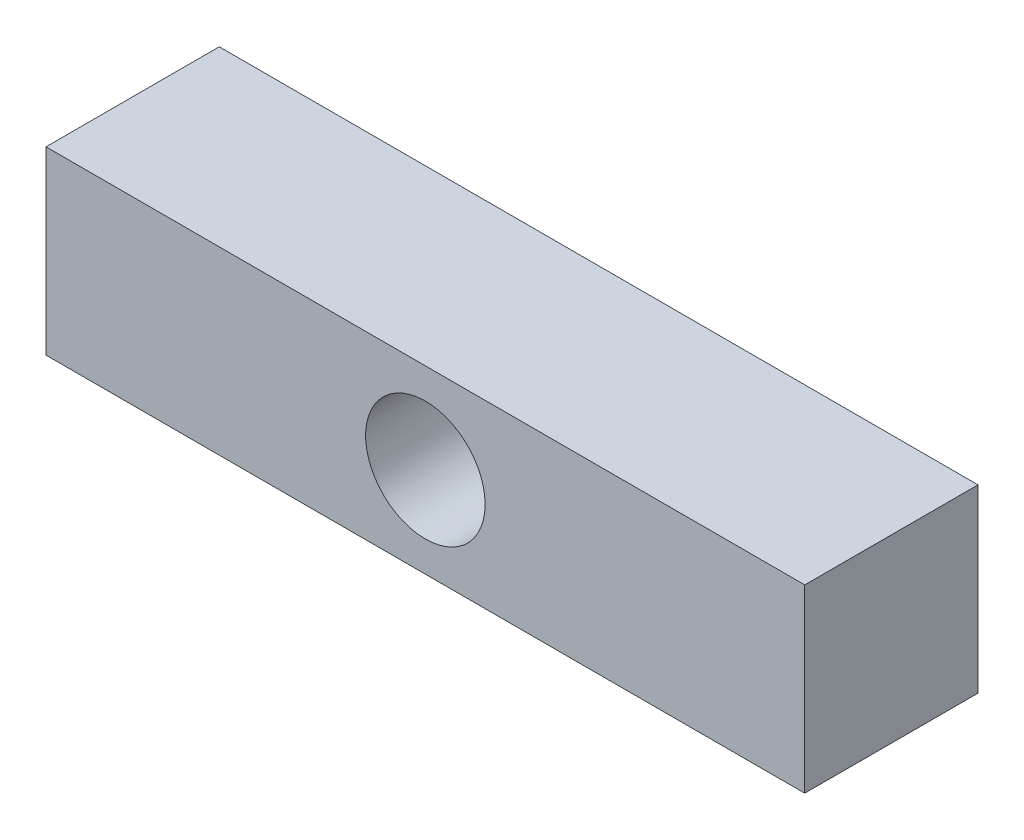
ISO-10303-21;
HEADER;
FILE_DESCRIPTION(('STEP AP214'),'2;1');
FILE_NAME('part.step','',(''),(''),'','','');
FILE_SCHEMA(('AUTOMOTIVE_DESIGN { 1 0 10303 214 1 1 1 1 }'));
ENDSEC;
DATA;
#1=APPLICATION_CONTEXT('core data for automotive mechanical design processes');
#2=APPLICATION_PROTOCOL_DEFINITION('international standard','automotive_design',2000,#1);
#3=PRODUCT_CONTEXT('',#1,'mechanical');
#4=PRODUCT('Part','Part','',(#3));
#5=PRODUCT_RELATED_PRODUCT_CATEGORY('part','',(#4));
#6=PRODUCT_DEFINITION_FORMATION('','',#4);
#7=PRODUCT_DEFINITION_CONTEXT('part definition',#1,'design');
#8=PRODUCT_DEFINITION('design','',#6,#7);
#9=PRODUCT_DEFINITION_SHAPE('','',#8);
#10=(LENGTH_UNIT() NAMED_UNIT(*) SI_UNIT(.MILLI.,.METRE.));
#11=(NAMED_UNIT(*) PLANE_ANGLE_UNIT() SI_UNIT($,.RADIAN.));
#12=(NAMED_UNIT(*) SI_UNIT($,.STERADIAN.) SOLID_ANGLE_UNIT());
#13=UNCERTAINTY_MEASURE_WITH_UNIT(LENGTH_MEASURE(1.E-05),#10,'distance_accuracy_value','');
#14=(GEOMETRIC_REPRESENTATION_CONTEXT(3) GLOBAL_UNCERTAINTY_ASSIGNED_CONTEXT((#13)) GLOBAL_UNIT_ASSIGNED_CONTEXT((#10,
#11,#12)) REPRESENTATION_CONTEXT('',''));
#15=CARTESIAN_POINT('',(0.,0.,0.));
#16=DIRECTION('',(0.,0.,1.));
#17=DIRECTION('',(1.,0.,0.));
#18=AXIS2_PLACEMENT_3D('',#15,#16,#17);
#19=CARTESIAN_POINT('',(12.7,6.04,2.9));
#20=DIRECTION('',(-1.,0.,0.));
#21=DIRECTION('',(0.,0.,1.));
#22=AXIS2_PLACEMENT_3D('',#19,#20,#21);
#23=PLANE('',#22);
#24=DIRECTION('',(0.,0.,-1.));
#25=VECTOR('',#24,1.);
#26=CARTESIAN_POINT('',(12.7,0.,2.9));
#27=LINE('',#26,#25);
#28=CARTESIAN_POINT('',(12.7,0.,2.9));
#29=VERTEX_POINT('',#28);
#30=CARTESIAN_POINT('',(12.7,0.,-2.9));
#31=VERTEX_POINT('',#30);
#32=EDGE_CURVE('E113',#29,#31,#27,.T.);
#33=ORIENTED_EDGE('',*,*,#32,.T.);
#34=DIRECTION('',(0.,-1.,0.));
#35=VECTOR('',#34,1.);
#36=CARTESIAN_POINT('',(12.7,6.04,-2.9));
#37=LINE('',#36,#35);
#38=CARTESIAN_POINT('',(12.7,6.04,-2.9));
#39=VERTEX_POINT('',#38);
#40=EDGE_CURVE('E11',#39,#31,#37,.T.);
#41=ORIENTED_EDGE('',*,*,#40,.F.);
#42=DIRECTION('',(0.,0.,-1.));
#43=VECTOR('',#42,1.);
#44=CARTESIAN_POINT('',(12.7,6.04,2.9));
#45=LINE('',#44,#43);
#46=CARTESIAN_POINT('',(12.7,6.04,2.9));
#47=VERTEX_POINT('',#46);
#48=EDGE_CURVE('E97',#47,#39,#45,.T.);
#49=ORIENTED_EDGE('',*,*,#48,.F.);
#50=DIRECTION('',(0.,-1.,0.));
#51=VECTOR('',#50,1.);
#52=CARTESIAN_POINT('',(12.7,6.04,2.9));
#53=LINE('',#52,#51);
#54=EDGE_CURVE('E109',#47,#29,#53,.T.);
#55=ORIENTED_EDGE('',*,*,#54,.T.);
#56=EDGE_LOOP('',(#33,#41,#49,#55));
#57=FACE_BOUND('',#56,.T.);
#58=ADVANCED_FACE('F45',(#57),#23,.F.);
#59=CARTESIAN_POINT('',(-12.7,6.04,-2.9));
#60=DIRECTION('',(0.,0.,1.));
#61=DIRECTION('',(1.,0.,0.));
#62=AXIS2_PLACEMENT_3D('',#59,#60,#61);
#63=PLANE('',#62);
#64=CARTESIAN_POINT('',(0.,3.02,-2.9));
#65=DIRECTION('',(0.,0.,1.));
#66=DIRECTION('',(1.,0.,0.));
#67=AXIS2_PLACEMENT_3D('',#64,#65,#66);
#68=CIRCLE('',#67,2.);
#69=CARTESIAN_POINT('',(2.,3.02,-2.9));
#70=VERTEX_POINT('',#69);
#71=EDGE_CURVE('E117',#70,#70,#68,.T.);
#72=ORIENTED_EDGE('',*,*,#71,.T.);
#73=EDGE_LOOP('',(#72));
#74=FACE_BOUND('',#73,.T.);
#75=DIRECTION('',(-1.,0.,0.));
#76=VECTOR('',#75,1.);
#77=CARTESIAN_POINT('',(-12.7,0.,-2.9));
#78=LINE('',#77,#76);
#79=CARTESIAN_POINT('',(-12.7,0.,-2.9));
#80=VERTEX_POINT('',#79);
#81=EDGE_CURVE('E102',#31,#80,#78,.T.);
#82=ORIENTED_EDGE('',*,*,#81,.T.);
#83=DIRECTION('',(0.,-1.,0.));
#84=VECTOR('',#83,1.);
#85=CARTESIAN_POINT('',(-12.7,6.04,-2.9));
#86=LINE('',#85,#84);
#87=CARTESIAN_POINT('',(-12.7,6.04,-2.9));
#88=VERTEX_POINT('',#87);
#89=EDGE_CURVE('E54',#88,#80,#86,.T.);
#90=ORIENTED_EDGE('',*,*,#89,.F.);
#91=DIRECTION('',(-1.,0.,0.));
#92=VECTOR('',#91,1.);
#93=CARTESIAN_POINT('',(-12.7,6.04,-2.9));
#94=LINE('',#93,#92);
#95=EDGE_CURVE('E92',#39,#88,#94,.T.);
#96=ORIENTED_EDGE('',*,*,#95,.F.);
#97=ORIENTED_EDGE('',*,*,#40,.T.);
#98=EDGE_LOOP('',(#82,#90,#96,#97));
#99=FACE_BOUND('',#98,.T.);
#100=ADVANCED_FACE('F101',(#74,#99),#63,.F.);
#101=CARTESIAN_POINT('',(-12.7,6.04,2.9));
#102=DIRECTION('',(1.,0.,0.));
#103=DIRECTION('',(0.,0.,-1.));
#104=AXIS2_PLACEMENT_3D('',#101,#102,#103);
#105=PLANE('',#104);
#106=DIRECTION('',(0.,0.,1.));
#107=VECTOR('',#106,1.);
#108=CARTESIAN_POINT('',(-12.7,0.,2.9));
#109=LINE('',#108,#107);
#110=CARTESIAN_POINT('',(-12.7,0.,2.9));
#111=VERTEX_POINT('',#110);
#112=EDGE_CURVE('E79',#80,#111,#109,.T.);
#113=ORIENTED_EDGE('',*,*,#112,.T.);
#114=DIRECTION('',(0.,-1.,0.));
#115=VECTOR('',#114,1.);
#116=CARTESIAN_POINT('',(-12.7,6.04,2.9));
#117=LINE('',#116,#115);
#118=CARTESIAN_POINT('',(-12.7,6.04,2.9));
#119=VERTEX_POINT('',#118);
#120=EDGE_CURVE('E104',#119,#111,#117,.T.);
#121=ORIENTED_EDGE('',*,*,#120,.F.);
#122=DIRECTION('',(0.,0.,1.));
#123=VECTOR('',#122,1.);
#124=CARTESIAN_POINT('',(-12.7,6.04,2.9));
#125=LINE('',#124,#123);
#126=EDGE_CURVE('E95',#88,#119,#125,.T.);
#127=ORIENTED_EDGE('',*,*,#126,.F.);
#128=ORIENTED_EDGE('',*,*,#89,.T.);
#129=EDGE_LOOP('',(#113,#121,#127,#128));
#130=FACE_BOUND('',#129,.T.);
#131=ADVANCED_FACE('F105',(#130),#105,.F.);
#132=CARTESIAN_POINT('',(-12.7,6.04,2.9));
#133=DIRECTION('',(0.,0.,-1.));
#134=DIRECTION('',(-1.,0.,0.));
#135=AXIS2_PLACEMENT_3D('',#132,#133,#134);
#136=PLANE('',#135);
#137=CARTESIAN_POINT('',(0.,3.02,2.9));
#138=DIRECTION('',(0.,0.,1.));
#139=DIRECTION('',(1.,0.,0.));
#140=AXIS2_PLACEMENT_3D('',#137,#138,#139);
#141=CIRCLE('',#140,2.);
#142=CARTESIAN_POINT('',(2.,3.02,2.9));
#143=VERTEX_POINT('',#142);
#144=EDGE_CURVE('E134',#143,#143,#141,.T.);
#145=ORIENTED_EDGE('',*,*,#144,.F.);
#146=EDGE_LOOP('',(#145));
#147=FACE_BOUND('',#146,.T.);
#148=DIRECTION('',(1.,0.,0.));
#149=VECTOR('',#148,1.);
#150=CARTESIAN_POINT('',(-12.7,0.,2.9));
#151=LINE('',#150,#149);
#152=EDGE_CURVE('E85',#111,#29,#151,.T.);
#153=ORIENTED_EDGE('',*,*,#152,.T.);
#154=ORIENTED_EDGE('',*,*,#54,.F.);
#155=DIRECTION('',(1.,0.,0.));
#156=VECTOR('',#155,1.);
#157=CARTESIAN_POINT('',(-12.7,6.04,2.9));
#158=LINE('',#157,#156);
#159=EDGE_CURVE('E62',#119,#47,#158,.T.);
#160=ORIENTED_EDGE('',*,*,#159,.F.);
#161=ORIENTED_EDGE('',*,*,#120,.T.);
#162=EDGE_LOOP('',(#153,#154,#160,#161));
#163=FACE_BOUND('',#162,.T.);
#164=ADVANCED_FACE('F127',(#147,#163),#136,.F.);
#165=CARTESIAN_POINT('',(0.,6.04,0.));
#166=DIRECTION('',(0.,-1.,0.));
#167=DIRECTION('',(0.,0.,-1.));
#168=AXIS2_PLACEMENT_3D('',#165,#166,#167);
#169=PLANE('',#168);
#170=ORIENTED_EDGE('',*,*,#48,.T.);
#171=ORIENTED_EDGE('',*,*,#95,.T.);
#172=ORIENTED_EDGE('',*,*,#126,.T.);
#173=ORIENTED_EDGE('',*,*,#159,.T.);
#174=EDGE_LOOP('',(#170,#171,#172,#173));
#175=FACE_BOUND('',#174,.T.);
#176=ADVANCED_FACE('F93',(#175),#169,.F.);
#177=CARTESIAN_POINT('',(0.,0.,0.));
#178=DIRECTION('',(0.,-1.,0.));
#179=DIRECTION('',(0.,0.,-1.));
#180=AXIS2_PLACEMENT_3D('',#177,#178,#179);
#181=PLANE('',#180);
#182=ORIENTED_EDGE('',*,*,#32,.F.);
#183=ORIENTED_EDGE('',*,*,#152,.F.);
#184=ORIENTED_EDGE('',*,*,#112,.F.);
#185=ORIENTED_EDGE('',*,*,#81,.F.);
#186=EDGE_LOOP('',(#182,#183,#184,#185));
#187=FACE_BOUND('',#186,.T.);
#188=ADVANCED_FACE('F130',(#187),#181,.T.);
#189=CARTESIAN_POINT('',(0.,3.02,-2.9));
#190=DIRECTION('',(0.,0.,1.));
#191=DIRECTION('',(1.,0.,0.));
#192=AXIS2_PLACEMENT_3D('',#189,#190,#191);
#193=CYLINDRICAL_SURFACE('',#192,2.);
#194=ORIENTED_EDGE('',*,*,#71,.F.);
#195=EDGE_LOOP('',(#194));
#196=FACE_BOUND('',#195,.T.);
#197=ORIENTED_EDGE('',*,*,#144,.T.);
#198=EDGE_LOOP('',(#197));
#199=FACE_BOUND('',#198,.T.);
#200=ADVANCED_FACE('F143',(#196,#199),#193,.F.);
#201=CLOSED_SHELL('',(#58,#100,#131,#164,#176,#188,#200));
#202=MANIFOLD_SOLID_BREP('B2',#201);
#203=ADVANCED_BREP_SHAPE_REPRESENTATION('',(#18,#202),#14);
#204=SHAPE_DEFINITION_REPRESENTATION(#9,#203);
ENDSEC;
END-ISO-10303-21;
